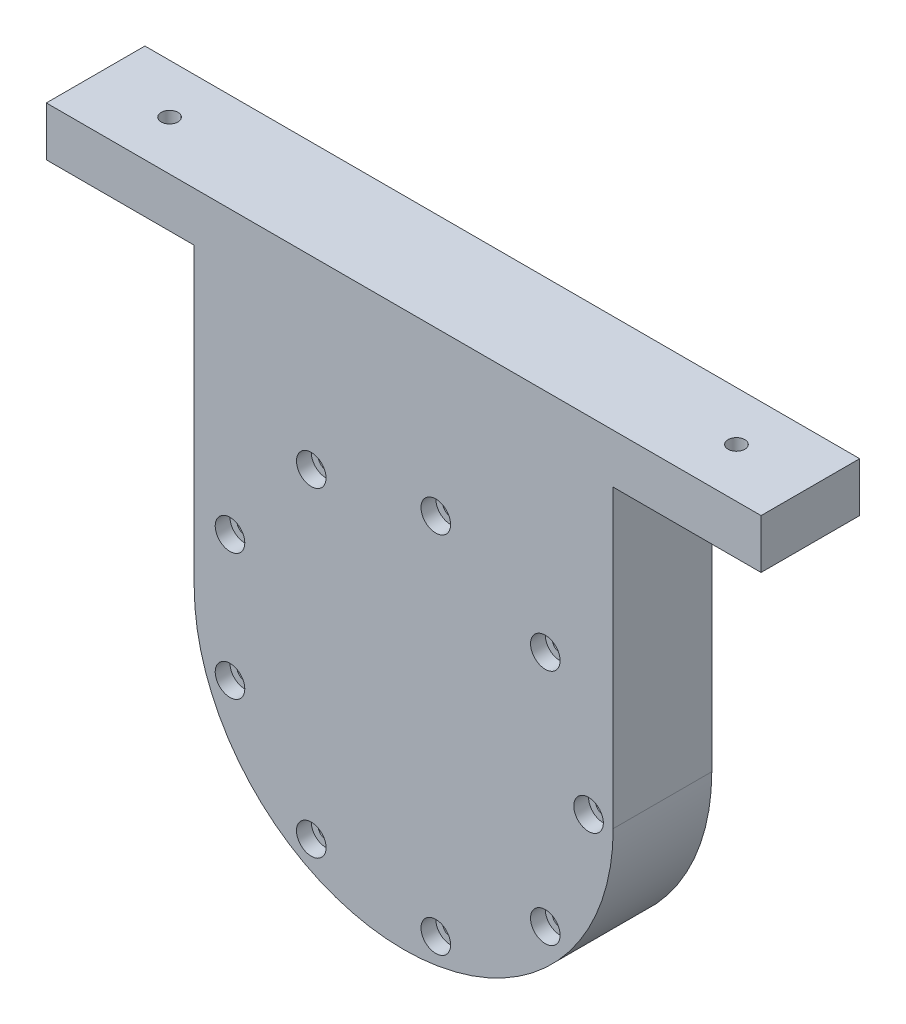
ISO-10303-21;
HEADER;
FILE_DESCRIPTION(('STEP AP214'),'2;1');
FILE_NAME('part.step','',(''),(''),'','','');
FILE_SCHEMA(('AUTOMOTIVE_DESIGN { 1 0 10303 214 1 1 1 1 }'));
ENDSEC;
DATA;
#1=APPLICATION_CONTEXT('core data for automotive mechanical design processes');
#2=APPLICATION_PROTOCOL_DEFINITION('international standard','automotive_design',2000,#1);
#3=PRODUCT_CONTEXT('',#1,'mechanical');
#4=PRODUCT('Part','Part','',(#3));
#5=PRODUCT_RELATED_PRODUCT_CATEGORY('part','',(#4));
#6=PRODUCT_DEFINITION_FORMATION('','',#4);
#7=PRODUCT_DEFINITION_CONTEXT('part definition',#1,'design');
#8=PRODUCT_DEFINITION('design','',#6,#7);
#9=PRODUCT_DEFINITION_SHAPE('','',#8);
#10=(LENGTH_UNIT() NAMED_UNIT(*) SI_UNIT(.MILLI.,.METRE.));
#11=(NAMED_UNIT(*) PLANE_ANGLE_UNIT() SI_UNIT($,.RADIAN.));
#12=(NAMED_UNIT(*) SI_UNIT($,.STERADIAN.) SOLID_ANGLE_UNIT());
#13=UNCERTAINTY_MEASURE_WITH_UNIT(LENGTH_MEASURE(1.E-05),#10,'distance_accuracy_value','');
#14=(GEOMETRIC_REPRESENTATION_CONTEXT(3) GLOBAL_UNCERTAINTY_ASSIGNED_CONTEXT((#13)) GLOBAL_UNIT_ASSIGNED_CONTEXT((#10,
#11,#12)) REPRESENTATION_CONTEXT('',''));
#15=CARTESIAN_POINT('',(0.,0.,0.));
#16=DIRECTION('',(0.,0.,1.));
#17=DIRECTION('',(1.,0.,0.));
#18=AXIS2_PLACEMENT_3D('',#15,#16,#17);
#19=CARTESIAN_POINT('',(37.5,0.,20.));
#20=DIRECTION('',(0.,0.,-1.));
#21=DIRECTION('',(-1.,0.,0.));
#22=AXIS2_PLACEMENT_3D('',#19,#20,#21);
#23=CYLINDRICAL_SURFACE('',#22,1.6);
#24=CARTESIAN_POINT('',(37.5,0.,0.));
#25=DIRECTION('',(0.,0.,1.));
#26=DIRECTION('',(1.,0.,0.));
#27=AXIS2_PLACEMENT_3D('',#24,#25,#26);
#28=CIRCLE('',#27,1.6);
#29=CARTESIAN_POINT('',(39.1,0.,0.));
#30=VERTEX_POINT('',#29);
#31=EDGE_CURVE('E142',#30,#30,#28,.T.);
#32=ORIENTED_EDGE('',*,*,#31,.F.);
#33=EDGE_LOOP('',(#32));
#34=FACE_BOUND('',#33,.T.);
#35=CARTESIAN_POINT('',(37.5,0.,17.));
#36=DIRECTION('',(0.,0.,1.));
#37=DIRECTION('',(1.,0.,0.));
#38=AXIS2_PLACEMENT_3D('',#35,#36,#37);
#39=CIRCLE('',#38,1.6);
#40=CARTESIAN_POINT('',(39.1,0.,17.));
#41=VERTEX_POINT('',#40);
#42=EDGE_CURVE('E43',#41,#41,#39,.T.);
#43=ORIENTED_EDGE('',*,*,#42,.T.);
#44=EDGE_LOOP('',(#43));
#45=FACE_BOUND('',#44,.T.);
#46=ADVANCED_FACE('F39',(#34,#45),#23,.F.);
#47=CARTESIAN_POINT('',(28.7266666169617,-24.1045353632452,20.));
#48=DIRECTION('',(0.,0.,-1.));
#49=DIRECTION('',(-1.,0.,0.));
#50=AXIS2_PLACEMENT_3D('',#47,#48,#49);
#51=CYLINDRICAL_SURFACE('',#50,1.6);
#52=CARTESIAN_POINT('',(28.7266666169617,-24.1045353632452,0.));
#53=DIRECTION('',(0.,0.,1.));
#54=DIRECTION('',(1.,0.,0.));
#55=AXIS2_PLACEMENT_3D('',#52,#53,#54);
#56=CIRCLE('',#55,1.6);
#57=CARTESIAN_POINT('',(30.3266666169617,-24.1045353632452,0.));
#58=VERTEX_POINT('',#57);
#59=EDGE_CURVE('E220',#58,#58,#56,.T.);
#60=ORIENTED_EDGE('',*,*,#59,.F.);
#61=EDGE_LOOP('',(#60));
#62=FACE_BOUND('',#61,.T.);
#63=CARTESIAN_POINT('',(28.7266666169617,-24.1045353632452,17.));
#64=DIRECTION('',(0.,0.,1.));
#65=DIRECTION('',(1.,0.,0.));
#66=AXIS2_PLACEMENT_3D('',#63,#64,#65);
#67=CIRCLE('',#66,1.6);
#68=CARTESIAN_POINT('',(30.3266666169617,-24.1045353632452,17.));
#69=VERTEX_POINT('',#68);
#70=EDGE_CURVE('E186',#69,#69,#67,.T.);
#71=ORIENTED_EDGE('',*,*,#70,.T.);
#72=EDGE_LOOP('',(#71));
#73=FACE_BOUND('',#72,.T.);
#74=ADVANCED_FACE('F264',(#62,#73),#51,.F.);
#75=CARTESIAN_POINT('',(6.51180666250989,-36.9302907379578,20.));
#76=DIRECTION('',(0.,0.,-1.));
#77=DIRECTION('',(-1.,0.,0.));
#78=AXIS2_PLACEMENT_3D('',#75,#76,#77);
#79=CYLINDRICAL_SURFACE('',#78,1.59999999999999);
#80=CARTESIAN_POINT('',(6.51180666250989,-36.9302907379578,0.));
#81=DIRECTION('',(0.,0.,1.));
#82=DIRECTION('',(1.,0.,0.));
#83=AXIS2_PLACEMENT_3D('',#80,#81,#82);
#84=CIRCLE('',#83,1.59999999999999);
#85=CARTESIAN_POINT('',(8.11180666250989,-36.9302907379578,0.));
#86=VERTEX_POINT('',#85);
#87=EDGE_CURVE('E217',#86,#86,#84,.T.);
#88=ORIENTED_EDGE('',*,*,#87,.F.);
#89=EDGE_LOOP('',(#88));
#90=FACE_BOUND('',#89,.T.);
#91=CARTESIAN_POINT('',(6.51180666250989,-36.9302907379578,17.));
#92=DIRECTION('',(0.,0.,1.));
#93=DIRECTION('',(1.,0.,0.));
#94=AXIS2_PLACEMENT_3D('',#91,#92,#93);
#95=CIRCLE('',#94,1.59999999999999);
#96=CARTESIAN_POINT('',(8.11180666250989,-36.9302907379578,17.));
#97=VERTEX_POINT('',#96);
#98=EDGE_CURVE('E184',#97,#97,#95,.T.);
#99=ORIENTED_EDGE('',*,*,#98,.T.);
#100=EDGE_LOOP('',(#99));
#101=FACE_BOUND('',#100,.T.);
#102=ADVANCED_FACE('F270',(#90,#101),#79,.F.);
#103=CARTESIAN_POINT('',(-18.75,-32.4759526419165,20.));
#104=DIRECTION('',(0.,0.,-1.));
#105=DIRECTION('',(-1.,0.,0.));
#106=AXIS2_PLACEMENT_3D('',#103,#104,#105);
#107=CYLINDRICAL_SURFACE('',#106,1.6);
#108=CARTESIAN_POINT('',(-18.75,-32.4759526419165,0.));
#109=DIRECTION('',(0.,0.,1.));
#110=DIRECTION('',(1.,0.,0.));
#111=AXIS2_PLACEMENT_3D('',#108,#109,#110);
#112=CIRCLE('',#111,1.6);
#113=CARTESIAN_POINT('',(-17.15,-32.4759526419165,0.));
#114=VERTEX_POINT('',#113);
#115=EDGE_CURVE('E214',#114,#114,#112,.T.);
#116=ORIENTED_EDGE('',*,*,#115,.F.);
#117=EDGE_LOOP('',(#116));
#118=FACE_BOUND('',#117,.T.);
#119=CARTESIAN_POINT('',(-18.75,-32.4759526419165,17.));
#120=DIRECTION('',(0.,0.,1.));
#121=DIRECTION('',(1.,0.,0.));
#122=AXIS2_PLACEMENT_3D('',#119,#120,#121);
#123=CIRCLE('',#122,1.6);
#124=CARTESIAN_POINT('',(-17.15,-32.4759526419165,17.));
#125=VERTEX_POINT('',#124);
#126=EDGE_CURVE('E181',#125,#125,#123,.T.);
#127=ORIENTED_EDGE('',*,*,#126,.T.);
#128=EDGE_LOOP('',(#127));
#129=FACE_BOUND('',#128,.T.);
#130=ADVANCED_FACE('F518',(#118,#129),#107,.F.);
#131=CARTESIAN_POINT('',(-35.2384732794716,-12.8257553747126,20.));
#132=DIRECTION('',(0.,0.,-1.));
#133=DIRECTION('',(-1.,0.,0.));
#134=AXIS2_PLACEMENT_3D('',#131,#132,#133);
#135=CYLINDRICAL_SURFACE('',#134,1.6);
#136=CARTESIAN_POINT('',(-35.2384732794716,-12.8257553747126,0.));
#137=DIRECTION('',(0.,0.,1.));
#138=DIRECTION('',(1.,0.,0.));
#139=AXIS2_PLACEMENT_3D('',#136,#137,#138);
#140=CIRCLE('',#139,1.6);
#141=CARTESIAN_POINT('',(-33.6384732794716,-12.8257553747126,0.));
#142=VERTEX_POINT('',#141);
#143=EDGE_CURVE('E211',#142,#142,#140,.T.);
#144=ORIENTED_EDGE('',*,*,#143,.F.);
#145=EDGE_LOOP('',(#144));
#146=FACE_BOUND('',#145,.T.);
#147=CARTESIAN_POINT('',(-35.2384732794716,-12.8257553747126,17.));
#148=DIRECTION('',(0.,0.,1.));
#149=DIRECTION('',(1.,0.,0.));
#150=AXIS2_PLACEMENT_3D('',#147,#148,#149);
#151=CIRCLE('',#150,1.6);
#152=CARTESIAN_POINT('',(-33.6384732794716,-12.8257553747126,17.));
#153=VERTEX_POINT('',#152);
#154=EDGE_CURVE('E178',#153,#153,#151,.T.);
#155=ORIENTED_EDGE('',*,*,#154,.T.);
#156=EDGE_LOOP('',(#155));
#157=FACE_BOUND('',#156,.T.);
#158=ADVANCED_FACE('F527',(#146,#157),#135,.F.);
#159=CARTESIAN_POINT('',(-35.2384732794716,12.8257553747126,20.));
#160=DIRECTION('',(0.,0.,-1.));
#161=DIRECTION('',(-1.,0.,0.));
#162=AXIS2_PLACEMENT_3D('',#159,#160,#161);
#163=CYLINDRICAL_SURFACE('',#162,1.6);
#164=CARTESIAN_POINT('',(-35.2384732794716,12.8257553747126,0.));
#165=DIRECTION('',(0.,0.,1.));
#166=DIRECTION('',(1.,0.,0.));
#167=AXIS2_PLACEMENT_3D('',#164,#165,#166);
#168=CIRCLE('',#167,1.6);
#169=CARTESIAN_POINT('',(-33.6384732794716,12.8257553747126,0.));
#170=VERTEX_POINT('',#169);
#171=EDGE_CURVE('E208',#170,#170,#168,.T.);
#172=ORIENTED_EDGE('',*,*,#171,.F.);
#173=EDGE_LOOP('',(#172));
#174=FACE_BOUND('',#173,.T.);
#175=CARTESIAN_POINT('',(-35.2384732794716,12.8257553747126,17.));
#176=DIRECTION('',(0.,0.,1.));
#177=DIRECTION('',(1.,0.,0.));
#178=AXIS2_PLACEMENT_3D('',#175,#176,#177);
#179=CIRCLE('',#178,1.6);
#180=CARTESIAN_POINT('',(-33.6384732794716,12.8257553747126,17.));
#181=VERTEX_POINT('',#180);
#182=EDGE_CURVE('E175',#181,#181,#179,.T.);
#183=ORIENTED_EDGE('',*,*,#182,.T.);
#184=EDGE_LOOP('',(#183));
#185=FACE_BOUND('',#184,.T.);
#186=ADVANCED_FACE('F537',(#174,#185),#163,.F.);
#187=CARTESIAN_POINT('',(-18.75,32.4759526419164,20.));
#188=DIRECTION('',(0.,0.,-1.));
#189=DIRECTION('',(-1.,0.,0.));
#190=AXIS2_PLACEMENT_3D('',#187,#188,#189);
#191=CYLINDRICAL_SURFACE('',#190,1.6);
#192=CARTESIAN_POINT('',(-18.75,32.4759526419164,0.));
#193=DIRECTION('',(0.,0.,1.));
#194=DIRECTION('',(1.,0.,0.));
#195=AXIS2_PLACEMENT_3D('',#192,#193,#194);
#196=CIRCLE('',#195,1.6);
#197=CARTESIAN_POINT('',(-17.15,32.4759526419164,0.));
#198=VERTEX_POINT('',#197);
#199=EDGE_CURVE('E200',#198,#198,#196,.T.);
#200=ORIENTED_EDGE('',*,*,#199,.F.);
#201=EDGE_LOOP('',(#200));
#202=FACE_BOUND('',#201,.T.);
#203=CARTESIAN_POINT('',(-18.75,32.4759526419164,17.));
#204=DIRECTION('',(0.,0.,1.));
#205=DIRECTION('',(1.,0.,0.));
#206=AXIS2_PLACEMENT_3D('',#203,#204,#205);
#207=CIRCLE('',#206,1.6);
#208=CARTESIAN_POINT('',(-17.15,32.4759526419164,17.));
#209=VERTEX_POINT('',#208);
#210=EDGE_CURVE('E172',#209,#209,#207,.T.);
#211=ORIENTED_EDGE('',*,*,#210,.T.);
#212=EDGE_LOOP('',(#211));
#213=FACE_BOUND('',#212,.T.);
#214=ADVANCED_FACE('F547',(#202,#213),#191,.F.);
#215=CARTESIAN_POINT('',(6.51180666250987,36.9302907379578,20.));
#216=DIRECTION('',(0.,0.,-1.));
#217=DIRECTION('',(-1.,0.,0.));
#218=AXIS2_PLACEMENT_3D('',#215,#216,#217);
#219=CYLINDRICAL_SURFACE('',#218,1.6);
#220=CARTESIAN_POINT('',(6.51180666250987,36.9302907379578,0.));
#221=DIRECTION('',(0.,0.,1.));
#222=DIRECTION('',(1.,0.,0.));
#223=AXIS2_PLACEMENT_3D('',#220,#221,#222);
#224=CIRCLE('',#223,1.6);
#225=CARTESIAN_POINT('',(8.11180666250987,36.9302907379578,0.));
#226=VERTEX_POINT('',#225);
#227=EDGE_CURVE('E195',#226,#226,#224,.T.);
#228=ORIENTED_EDGE('',*,*,#227,.F.);
#229=EDGE_LOOP('',(#228));
#230=FACE_BOUND('',#229,.T.);
#231=CARTESIAN_POINT('',(6.51180666250987,36.9302907379578,17.));
#232=DIRECTION('',(0.,0.,1.));
#233=DIRECTION('',(1.,0.,0.));
#234=AXIS2_PLACEMENT_3D('',#231,#232,#233);
#235=CIRCLE('',#234,1.6);
#236=CARTESIAN_POINT('',(8.11180666250987,36.9302907379578,17.));
#237=VERTEX_POINT('',#236);
#238=EDGE_CURVE('E168',#237,#237,#235,.T.);
#239=ORIENTED_EDGE('',*,*,#238,.T.);
#240=EDGE_LOOP('',(#239));
#241=FACE_BOUND('',#240,.T.);
#242=ADVANCED_FACE('F557',(#230,#241),#219,.F.);
#243=CARTESIAN_POINT('',(28.7266666169617,24.1045353632452,20.));
#244=DIRECTION('',(0.,0.,-1.));
#245=DIRECTION('',(-1.,0.,0.));
#246=AXIS2_PLACEMENT_3D('',#243,#244,#245);
#247=CYLINDRICAL_SURFACE('',#246,1.6);
#248=CARTESIAN_POINT('',(28.7266666169617,24.1045353632452,0.));
#249=DIRECTION('',(0.,0.,1.));
#250=DIRECTION('',(1.,0.,0.));
#251=AXIS2_PLACEMENT_3D('',#248,#249,#250);
#252=CIRCLE('',#251,1.6);
#253=CARTESIAN_POINT('',(30.3266666169617,24.1045353632452,0.));
#254=VERTEX_POINT('',#253);
#255=EDGE_CURVE('E191',#254,#254,#252,.T.);
#256=ORIENTED_EDGE('',*,*,#255,.F.);
#257=EDGE_LOOP('',(#256));
#258=FACE_BOUND('',#257,.T.);
#259=CARTESIAN_POINT('',(28.7266666169617,24.1045353632452,17.));
#260=DIRECTION('',(0.,0.,1.));
#261=DIRECTION('',(1.,0.,0.));
#262=AXIS2_PLACEMENT_3D('',#259,#260,#261);
#263=CIRCLE('',#262,1.6);
#264=CARTESIAN_POINT('',(30.3266666169617,24.1045353632452,17.));
#265=VERTEX_POINT('',#264);
#266=EDGE_CURVE('E165',#265,#265,#263,.T.);
#267=ORIENTED_EDGE('',*,*,#266,.T.);
#268=EDGE_LOOP('',(#267));
#269=FACE_BOUND('',#268,.T.);
#270=ADVANCED_FACE('F277',(#258,#269),#247,.F.);
#271=CARTESIAN_POINT('',(0.,0.,20.));
#272=DIRECTION('',(0.,0.,1.));
#273=DIRECTION('',(1.,0.,0.));
#274=AXIS2_PLACEMENT_3D('',#271,#272,#273);
#275=PLANE('',#274);
#276=CARTESIAN_POINT('',(-18.75,32.4759526419165,20.));
#277=DIRECTION('',(0.,0.,1.));
#278=DIRECTION('',(1.,0.,0.));
#279=AXIS2_PLACEMENT_3D('',#276,#277,#278);
#280=CIRCLE('',#279,3.);
#281=CARTESIAN_POINT('',(-15.75,32.4759526419165,20.));
#282=VERTEX_POINT('',#281);
#283=EDGE_CURVE('E683',#282,#282,#280,.T.);
#284=ORIENTED_EDGE('',*,*,#283,.F.);
#285=EDGE_LOOP('',(#284));
#286=FACE_BOUND('',#285,.T.);
#287=CARTESIAN_POINT('',(-35.2384732794716,12.8257553747125,20.));
#288=DIRECTION('',(0.,0.,1.));
#289=DIRECTION('',(1.,0.,0.));
#290=AXIS2_PLACEMENT_3D('',#287,#288,#289);
#291=CIRCLE('',#290,3.);
#292=CARTESIAN_POINT('',(-32.2384732794716,12.8257553747125,20.));
#293=VERTEX_POINT('',#292);
#294=EDGE_CURVE('E677',#293,#293,#291,.T.);
#295=ORIENTED_EDGE('',*,*,#294,.F.);
#296=EDGE_LOOP('',(#295));
#297=FACE_BOUND('',#296,.T.);
#298=CARTESIAN_POINT('',(-35.2384732794716,-12.8257553747126,20.));
#299=DIRECTION('',(0.,0.,1.));
#300=DIRECTION('',(1.,0.,0.));
#301=AXIS2_PLACEMENT_3D('',#298,#299,#300);
#302=CIRCLE('',#301,2.99999999999999);
#303=CARTESIAN_POINT('',(-32.2384732794716,-12.8257553747126,20.));
#304=VERTEX_POINT('',#303);
#305=EDGE_CURVE('E671',#304,#304,#302,.T.);
#306=ORIENTED_EDGE('',*,*,#305,.F.);
#307=EDGE_LOOP('',(#306));
#308=FACE_BOUND('',#307,.T.);
#309=CARTESIAN_POINT('',(-18.75,-32.4759526419165,20.));
#310=DIRECTION('',(0.,0.,1.));
#311=DIRECTION('',(1.,0.,0.));
#312=AXIS2_PLACEMENT_3D('',#309,#310,#311);
#313=CIRCLE('',#312,3.);
#314=CARTESIAN_POINT('',(-15.75,-32.4759526419165,20.));
#315=VERTEX_POINT('',#314);
#316=EDGE_CURVE('E665',#315,#315,#313,.T.);
#317=ORIENTED_EDGE('',*,*,#316,.F.);
#318=EDGE_LOOP('',(#317));
#319=FACE_BOUND('',#318,.T.);
#320=CARTESIAN_POINT('',(6.51180666250991,-36.9302907379578,20.));
#321=DIRECTION('',(0.,0.,1.));
#322=DIRECTION('',(1.,0.,0.));
#323=AXIS2_PLACEMENT_3D('',#320,#321,#322);
#324=CIRCLE('',#323,3.);
#325=CARTESIAN_POINT('',(9.51180666250991,-36.9302907379578,20.));
#326=VERTEX_POINT('',#325);
#327=EDGE_CURVE('E659',#326,#326,#324,.T.);
#328=ORIENTED_EDGE('',*,*,#327,.F.);
#329=EDGE_LOOP('',(#328));
#330=FACE_BOUND('',#329,.T.);
#331=CARTESIAN_POINT('',(28.7266666169617,-24.1045353632452,20.));
#332=DIRECTION('',(0.,0.,1.));
#333=DIRECTION('',(1.,0.,0.));
#334=AXIS2_PLACEMENT_3D('',#331,#332,#333);
#335=CIRCLE('',#334,3.);
#336=CARTESIAN_POINT('',(31.7266666169617,-24.1045353632452,20.));
#337=VERTEX_POINT('',#336);
#338=EDGE_CURVE('E653',#337,#337,#335,.T.);
#339=ORIENTED_EDGE('',*,*,#338,.F.);
#340=EDGE_LOOP('',(#339));
#341=FACE_BOUND('',#340,.T.);
#342=CARTESIAN_POINT('',(37.5,0.,20.));
#343=DIRECTION('',(0.,0.,1.));
#344=DIRECTION('',(1.,0.,0.));
#345=AXIS2_PLACEMENT_3D('',#342,#343,#344);
#346=CIRCLE('',#345,2.99999999999999);
#347=CARTESIAN_POINT('',(40.5,0.,20.));
#348=VERTEX_POINT('',#347);
#349=EDGE_CURVE('E642',#348,#348,#346,.T.);
#350=ORIENTED_EDGE('',*,*,#349,.F.);
#351=EDGE_LOOP('',(#350));
#352=FACE_BOUND('',#351,.T.);
#353=CARTESIAN_POINT('',(28.7266666169617,24.1045353632452,20.));
#354=DIRECTION('',(0.,0.,1.));
#355=DIRECTION('',(1.,0.,0.));
#356=AXIS2_PLACEMENT_3D('',#353,#354,#355);
#357=CIRCLE('',#356,3.);
#358=CARTESIAN_POINT('',(31.7266666169617,24.1045353632452,20.));
#359=VERTEX_POINT('',#358);
#360=EDGE_CURVE('E641',#359,#359,#357,.T.);
#361=ORIENTED_EDGE('',*,*,#360,.F.);
#362=EDGE_LOOP('',(#361));
#363=FACE_BOUND('',#362,.T.);
#364=CARTESIAN_POINT('',(6.51180666250987,36.9302907379578,20.));
#365=DIRECTION('',(0.,0.,1.));
#366=DIRECTION('',(1.,0.,0.));
#367=AXIS2_PLACEMENT_3D('',#364,#365,#366);
#368=CIRCLE('',#367,3.);
#369=CARTESIAN_POINT('',(9.51180666250987,36.9302907379578,20.));
#370=VERTEX_POINT('',#369);
#371=EDGE_CURVE('E203',#370,#370,#368,.T.);
#372=ORIENTED_EDGE('',*,*,#371,.F.);
#373=EDGE_LOOP('',(#372));
#374=FACE_BOUND('',#373,.T.);
#375=CARTESIAN_POINT('',(0.,0.,20.));
#376=DIRECTION('',(0.,0.,1.));
#377=DIRECTION('',(1.,0.,0.));
#378=AXIS2_PLACEMENT_3D('',#375,#376,#377);
#379=CIRCLE('',#378,42.5);
#380=CARTESIAN_POINT('',(-42.5,0.,20.));
#381=VERTEX_POINT('',#380);
#382=CARTESIAN_POINT('',(42.5,0.,20.));
#383=VERTEX_POINT('',#382);
#384=EDGE_CURVE('E153',#381,#383,#379,.T.);
#385=ORIENTED_EDGE('',*,*,#384,.T.);
#386=DIRECTION('',(0.,1.,0.));
#387=VECTOR('',#386,1.);
#388=CARTESIAN_POINT('',(42.5,0.,20.));
#389=LINE('',#388,#387);
#390=CARTESIAN_POINT('',(42.5,60.,20.));
#391=VERTEX_POINT('',#390);
#392=EDGE_CURVE('E101',#383,#391,#389,.T.);
#393=ORIENTED_EDGE('',*,*,#392,.T.);
#394=DIRECTION('',(1.,0.,0.));
#395=VECTOR('',#394,1.);
#396=CARTESIAN_POINT('',(42.5,60.,20.));
#397=LINE('',#396,#395);
#398=CARTESIAN_POINT('',(72.5,60.,20.));
#399=VERTEX_POINT('',#398);
#400=EDGE_CURVE('E227',#391,#399,#397,.T.);
#401=ORIENTED_EDGE('',*,*,#400,.T.);
#402=DIRECTION('',(0.,1.,0.));
#403=VECTOR('',#402,1.);
#404=CARTESIAN_POINT('',(72.5,70.,20.));
#405=LINE('',#404,#403);
#406=CARTESIAN_POINT('',(72.5,70.,20.));
#407=VERTEX_POINT('',#406);
#408=EDGE_CURVE('E229',#399,#407,#405,.T.);
#409=ORIENTED_EDGE('',*,*,#408,.T.);
#410=DIRECTION('',(-1.,0.,0.));
#411=VECTOR('',#410,1.);
#412=CARTESIAN_POINT('',(-72.5,70.,20.));
#413=LINE('',#412,#411);
#414=CARTESIAN_POINT('',(-72.5,70.,20.));
#415=VERTEX_POINT('',#414);
#416=EDGE_CURVE('E120',#407,#415,#413,.T.);
#417=ORIENTED_EDGE('',*,*,#416,.T.);
#418=DIRECTION('',(0.,-1.,0.));
#419=VECTOR('',#418,1.);
#420=CARTESIAN_POINT('',(-72.5,60.,20.));
#421=LINE('',#420,#419);
#422=CARTESIAN_POINT('',(-72.5,60.,20.));
#423=VERTEX_POINT('',#422);
#424=EDGE_CURVE('E114',#415,#423,#421,.T.);
#425=ORIENTED_EDGE('',*,*,#424,.T.);
#426=DIRECTION('',(1.,0.,0.));
#427=VECTOR('',#426,1.);
#428=CARTESIAN_POINT('',(-42.5,60.,20.));
#429=LINE('',#428,#427);
#430=CARTESIAN_POINT('',(-42.5,60.,20.));
#431=VERTEX_POINT('',#430);
#432=EDGE_CURVE('E118',#423,#431,#429,.T.);
#433=ORIENTED_EDGE('',*,*,#432,.T.);
#434=DIRECTION('',(0.,-1.,0.));
#435=VECTOR('',#434,1.);
#436=CARTESIAN_POINT('',(-42.5,0.,20.));
#437=LINE('',#436,#435);
#438=EDGE_CURVE('E58',#431,#381,#437,.T.);
#439=ORIENTED_EDGE('',*,*,#438,.T.);
#440=EDGE_LOOP('',(#385,#393,#401,#409,#417,#425,#433,#439));
#441=FACE_BOUND('',#440,.T.);
#442=ADVANCED_FACE('F116',(#286,#297,#308,#319,#330,#341,#352,#363,#374,#441),#275,.T.);
#443=CARTESIAN_POINT('',(0.,0.,0.));
#444=DIRECTION('',(0.,0.,1.));
#445=DIRECTION('',(1.,0.,0.));
#446=AXIS2_PLACEMENT_3D('',#443,#444,#445);
#447=PLANE('',#446);
#448=CARTESIAN_POINT('',(0.,0.,0.));
#449=DIRECTION('',(0.,0.,1.));
#450=DIRECTION('',(1.,0.,0.));
#451=AXIS2_PLACEMENT_3D('',#448,#449,#450);
#452=CIRCLE('',#451,42.5);
#453=CARTESIAN_POINT('',(-42.5,0.,0.));
#454=VERTEX_POINT('',#453);
#455=CARTESIAN_POINT('',(42.5,0.,0.));
#456=VERTEX_POINT('',#455);
#457=EDGE_CURVE('E138',#454,#456,#452,.T.);
#458=ORIENTED_EDGE('',*,*,#457,.F.);
#459=DIRECTION('',(0.,-1.,0.));
#460=VECTOR('',#459,1.);
#461=CARTESIAN_POINT('',(-42.5,0.,0.));
#462=LINE('',#461,#460);
#463=CARTESIAN_POINT('',(-42.5,60.,0.));
#464=VERTEX_POINT('',#463);
#465=EDGE_CURVE('E93',#464,#454,#462,.T.);
#466=ORIENTED_EDGE('',*,*,#465,.F.);
#467=DIRECTION('',(1.,0.,0.));
#468=VECTOR('',#467,1.);
#469=CARTESIAN_POINT('',(-42.5,60.,0.));
#470=LINE('',#469,#468);
#471=CARTESIAN_POINT('',(-72.5,60.,0.));
#472=VERTEX_POINT('',#471);
#473=EDGE_CURVE('E87',#472,#464,#470,.T.);
#474=ORIENTED_EDGE('',*,*,#473,.F.);
#475=DIRECTION('',(0.,-1.,0.));
#476=VECTOR('',#475,1.);
#477=CARTESIAN_POINT('',(-72.5,60.,0.));
#478=LINE('',#477,#476);
#479=CARTESIAN_POINT('',(-72.5,70.,0.));
#480=VERTEX_POINT('',#479);
#481=EDGE_CURVE('E128',#480,#472,#478,.T.);
#482=ORIENTED_EDGE('',*,*,#481,.F.);
#483=DIRECTION('',(-1.,0.,0.));
#484=VECTOR('',#483,1.);
#485=CARTESIAN_POINT('',(-72.5,70.,0.));
#486=LINE('',#485,#484);
#487=CARTESIAN_POINT('',(72.5,70.,0.));
#488=VERTEX_POINT('',#487);
#489=EDGE_CURVE('E148',#488,#480,#486,.T.);
#490=ORIENTED_EDGE('',*,*,#489,.F.);
#491=DIRECTION('',(0.,1.,0.));
#492=VECTOR('',#491,1.);
#493=CARTESIAN_POINT('',(72.5,70.,0.));
#494=LINE('',#493,#492);
#495=CARTESIAN_POINT('',(72.5,60.,0.));
#496=VERTEX_POINT('',#495);
#497=EDGE_CURVE('E146',#496,#488,#494,.T.);
#498=ORIENTED_EDGE('',*,*,#497,.F.);
#499=DIRECTION('',(1.,0.,0.));
#500=VECTOR('',#499,1.);
#501=CARTESIAN_POINT('',(42.5,60.,0.));
#502=LINE('',#501,#500);
#503=CARTESIAN_POINT('',(42.5,60.,0.));
#504=VERTEX_POINT('',#503);
#505=EDGE_CURVE('E144',#504,#496,#502,.T.);
#506=ORIENTED_EDGE('',*,*,#505,.F.);
#507=DIRECTION('',(0.,1.,0.));
#508=VECTOR('',#507,1.);
#509=CARTESIAN_POINT('',(42.5,0.,0.));
#510=LINE('',#509,#508);
#511=EDGE_CURVE('E141',#456,#504,#510,.T.);
#512=ORIENTED_EDGE('',*,*,#511,.F.);
#513=EDGE_LOOP('',(#458,#466,#474,#482,#490,#498,#506,#512));
#514=FACE_BOUND('',#513,.T.);
#515=ORIENTED_EDGE('',*,*,#31,.T.);
#516=EDGE_LOOP('',(#515));
#517=FACE_BOUND('',#516,.T.);
#518=ORIENTED_EDGE('',*,*,#59,.T.);
#519=EDGE_LOOP('',(#518));
#520=FACE_BOUND('',#519,.T.);
#521=ORIENTED_EDGE('',*,*,#87,.T.);
#522=EDGE_LOOP('',(#521));
#523=FACE_BOUND('',#522,.T.);
#524=ORIENTED_EDGE('',*,*,#115,.T.);
#525=EDGE_LOOP('',(#524));
#526=FACE_BOUND('',#525,.T.);
#527=ORIENTED_EDGE('',*,*,#143,.T.);
#528=EDGE_LOOP('',(#527));
#529=FACE_BOUND('',#528,.T.);
#530=ORIENTED_EDGE('',*,*,#171,.T.);
#531=EDGE_LOOP('',(#530));
#532=FACE_BOUND('',#531,.T.);
#533=ORIENTED_EDGE('',*,*,#199,.T.);
#534=EDGE_LOOP('',(#533));
#535=FACE_BOUND('',#534,.T.);
#536=ORIENTED_EDGE('',*,*,#227,.T.);
#537=EDGE_LOOP('',(#536));
#538=FACE_BOUND('',#537,.T.);
#539=ORIENTED_EDGE('',*,*,#255,.T.);
#540=EDGE_LOOP('',(#539));
#541=FACE_BOUND('',#540,.T.);
#542=ADVANCED_FACE('F242',(#514,#517,#520,#523,#526,#529,#532,#535,#538,#541),#447,.F.);
#543=CARTESIAN_POINT('',(0.,0.,20.));
#544=DIRECTION('',(0.,0.,-1.));
#545=DIRECTION('',(-1.,0.,0.));
#546=AXIS2_PLACEMENT_3D('',#543,#544,#545);
#547=CYLINDRICAL_SURFACE('',#546,42.5);
#548=ORIENTED_EDGE('',*,*,#457,.T.);
#549=DIRECTION('',(0.,0.,-1.));
#550=VECTOR('',#549,1.);
#551=CARTESIAN_POINT('',(42.5,0.,20.));
#552=LINE('',#551,#550);
#553=EDGE_CURVE('E11',#383,#456,#552,.T.);
#554=ORIENTED_EDGE('',*,*,#553,.F.);
#555=ORIENTED_EDGE('',*,*,#384,.F.);
#556=DIRECTION('',(0.,0.,-1.));
#557=VECTOR('',#556,1.);
#558=CARTESIAN_POINT('',(-42.5,0.,20.));
#559=LINE('',#558,#557);
#560=EDGE_CURVE('E134',#381,#454,#559,.T.);
#561=ORIENTED_EDGE('',*,*,#560,.T.);
#562=EDGE_LOOP('',(#548,#554,#555,#561));
#563=FACE_BOUND('',#562,.T.);
#564=ADVANCED_FACE('F41',(#563),#547,.T.);
#565=CARTESIAN_POINT('',(42.5,0.,20.));
#566=DIRECTION('',(-1.,0.,0.));
#567=DIRECTION('',(0.,0.,1.));
#568=AXIS2_PLACEMENT_3D('',#565,#566,#567);
#569=PLANE('',#568);
#570=ORIENTED_EDGE('',*,*,#511,.T.);
#571=DIRECTION('',(0.,0.,-1.));
#572=VECTOR('',#571,1.);
#573=CARTESIAN_POINT('',(42.5,60.,20.));
#574=LINE('',#573,#572);
#575=EDGE_CURVE('E49',#391,#504,#574,.T.);
#576=ORIENTED_EDGE('',*,*,#575,.F.);
#577=ORIENTED_EDGE('',*,*,#392,.F.);
#578=ORIENTED_EDGE('',*,*,#553,.T.);
#579=EDGE_LOOP('',(#570,#576,#577,#578));
#580=FACE_BOUND('',#579,.T.);
#581=ADVANCED_FACE('F283',(#580),#569,.F.);
#582=CARTESIAN_POINT('',(42.5,60.,20.));
#583=DIRECTION('',(0.,1.,0.));
#584=DIRECTION('',(0.,0.,1.));
#585=AXIS2_PLACEMENT_3D('',#582,#583,#584);
#586=PLANE('',#585);
#587=CARTESIAN_POINT('',(57.5,60.,10.));
#588=DIRECTION('',(0.,-1.,0.));
#589=DIRECTION('',(0.,0.,-1.));
#590=AXIS2_PLACEMENT_3D('',#587,#588,#589);
#591=CIRCLE('',#590,1.7);
#592=CARTESIAN_POINT('',(57.5,60.,8.3));
#593=VERTEX_POINT('',#592);
#594=EDGE_CURVE('E699',#593,#593,#591,.T.);
#595=ORIENTED_EDGE('',*,*,#594,.F.);
#596=EDGE_LOOP('',(#595));
#597=FACE_BOUND('',#596,.T.);
#598=ORIENTED_EDGE('',*,*,#505,.T.);
#599=DIRECTION('',(0.,0.,-1.));
#600=VECTOR('',#599,1.);
#601=CARTESIAN_POINT('',(72.5,60.,20.));
#602=LINE('',#601,#600);
#603=EDGE_CURVE('E160',#399,#496,#602,.T.);
#604=ORIENTED_EDGE('',*,*,#603,.F.);
#605=ORIENTED_EDGE('',*,*,#400,.F.);
#606=ORIENTED_EDGE('',*,*,#575,.T.);
#607=EDGE_LOOP('',(#598,#604,#605,#606));
#608=FACE_BOUND('',#607,.T.);
#609=ADVANCED_FACE('F287',(#597,#608),#586,.F.);
#610=CARTESIAN_POINT('',(72.5,70.,20.));
#611=DIRECTION('',(-1.,0.,0.));
#612=DIRECTION('',(0.,-1.,0.));
#613=AXIS2_PLACEMENT_3D('',#610,#611,#612);
#614=PLANE('',#613);
#615=ORIENTED_EDGE('',*,*,#497,.T.);
#616=DIRECTION('',(0.,0.,-1.));
#617=VECTOR('',#616,1.);
#618=CARTESIAN_POINT('',(72.5,70.,20.));
#619=LINE('',#618,#617);
#620=EDGE_CURVE('E157',#407,#488,#619,.T.);
#621=ORIENTED_EDGE('',*,*,#620,.F.);
#622=ORIENTED_EDGE('',*,*,#408,.F.);
#623=ORIENTED_EDGE('',*,*,#603,.T.);
#624=EDGE_LOOP('',(#615,#621,#622,#623));
#625=FACE_BOUND('',#624,.T.);
#626=ADVANCED_FACE('F235',(#625),#614,.F.);
#627=CARTESIAN_POINT('',(-72.5,70.,20.));
#628=DIRECTION('',(0.,-1.,0.));
#629=DIRECTION('',(1.,0.,0.));
#630=AXIS2_PLACEMENT_3D('',#627,#628,#629);
#631=PLANE('',#630);
#632=CARTESIAN_POINT('',(57.5,70.,10.));
#633=DIRECTION('',(0.,-1.,0.));
#634=DIRECTION('',(0.,0.,-1.));
#635=AXIS2_PLACEMENT_3D('',#632,#633,#634);
#636=CIRCLE('',#635,1.7);
#637=CARTESIAN_POINT('',(57.5,70.,8.3));
#638=VERTEX_POINT('',#637);
#639=EDGE_CURVE('E688',#638,#638,#636,.T.);
#640=ORIENTED_EDGE('',*,*,#639,.T.);
#641=EDGE_LOOP('',(#640));
#642=FACE_BOUND('',#641,.T.);
#643=CARTESIAN_POINT('',(-57.5,70.,10.));
#644=DIRECTION('',(0.,-1.,0.));
#645=DIRECTION('',(0.,0.,-1.));
#646=AXIS2_PLACEMENT_3D('',#643,#644,#645);
#647=CIRCLE('',#646,1.7);
#648=CARTESIAN_POINT('',(-57.5,70.,8.3));
#649=VERTEX_POINT('',#648);
#650=EDGE_CURVE('E707',#649,#649,#647,.T.);
#651=ORIENTED_EDGE('',*,*,#650,.T.);
#652=EDGE_LOOP('',(#651));
#653=FACE_BOUND('',#652,.T.);
#654=ORIENTED_EDGE('',*,*,#489,.T.);
#655=DIRECTION('',(0.,0.,-1.));
#656=VECTOR('',#655,1.);
#657=CARTESIAN_POINT('',(-72.5,70.,20.));
#658=LINE('',#657,#656);
#659=EDGE_CURVE('E129',#415,#480,#658,.T.);
#660=ORIENTED_EDGE('',*,*,#659,.F.);
#661=ORIENTED_EDGE('',*,*,#416,.F.);
#662=ORIENTED_EDGE('',*,*,#620,.T.);
#663=EDGE_LOOP('',(#654,#660,#661,#662));
#664=FACE_BOUND('',#663,.T.);
#665=ADVANCED_FACE('F239',(#642,#653,#664),#631,.F.);
#666=CARTESIAN_POINT('',(-72.5,60.,20.));
#667=DIRECTION('',(1.,0.,0.));
#668=DIRECTION('',(0.,1.,0.));
#669=AXIS2_PLACEMENT_3D('',#666,#667,#668);
#670=PLANE('',#669);
#671=ORIENTED_EDGE('',*,*,#481,.T.);
#672=DIRECTION('',(0.,0.,-1.));
#673=VECTOR('',#672,1.);
#674=CARTESIAN_POINT('',(-72.5,60.,20.));
#675=LINE('',#674,#673);
#676=EDGE_CURVE('E125',#423,#472,#675,.T.);
#677=ORIENTED_EDGE('',*,*,#676,.F.);
#678=ORIENTED_EDGE('',*,*,#424,.F.);
#679=ORIENTED_EDGE('',*,*,#659,.T.);
#680=EDGE_LOOP('',(#671,#677,#678,#679));
#681=FACE_BOUND('',#680,.T.);
#682=ADVANCED_FACE('F126',(#681),#670,.F.);
#683=CARTESIAN_POINT('',(-42.5,60.,20.));
#684=DIRECTION('',(0.,1.,0.));
#685=DIRECTION('',(-1.,0.,0.));
#686=AXIS2_PLACEMENT_3D('',#683,#684,#685);
#687=PLANE('',#686);
#688=CARTESIAN_POINT('',(-57.5,60.,10.));
#689=DIRECTION('',(0.,-1.,0.));
#690=DIRECTION('',(0.,0.,-1.));
#691=AXIS2_PLACEMENT_3D('',#688,#689,#690);
#692=CIRCLE('',#691,1.7);
#693=CARTESIAN_POINT('',(-57.5,60.,8.3));
#694=VERTEX_POINT('',#693);
#695=EDGE_CURVE('E703',#694,#694,#692,.T.);
#696=ORIENTED_EDGE('',*,*,#695,.F.);
#697=EDGE_LOOP('',(#696));
#698=FACE_BOUND('',#697,.T.);
#699=ORIENTED_EDGE('',*,*,#473,.T.);
#700=DIRECTION('',(0.,0.,-1.));
#701=VECTOR('',#700,1.);
#702=CARTESIAN_POINT('',(-42.5,60.,20.));
#703=LINE('',#702,#701);
#704=EDGE_CURVE('E130',#431,#464,#703,.T.);
#705=ORIENTED_EDGE('',*,*,#704,.F.);
#706=ORIENTED_EDGE('',*,*,#432,.F.);
#707=ORIENTED_EDGE('',*,*,#676,.T.);
#708=EDGE_LOOP('',(#699,#705,#706,#707));
#709=FACE_BOUND('',#708,.T.);
#710=ADVANCED_FACE('F132',(#698,#709),#687,.F.);
#711=CARTESIAN_POINT('',(-42.5,0.,20.));
#712=DIRECTION('',(1.,0.,0.));
#713=DIRECTION('',(0.,0.,-1.));
#714=AXIS2_PLACEMENT_3D('',#711,#712,#713);
#715=PLANE('',#714);
#716=ORIENTED_EDGE('',*,*,#465,.T.);
#717=ORIENTED_EDGE('',*,*,#560,.F.);
#718=ORIENTED_EDGE('',*,*,#438,.F.);
#719=ORIENTED_EDGE('',*,*,#704,.T.);
#720=EDGE_LOOP('',(#716,#717,#718,#719));
#721=FACE_BOUND('',#720,.T.);
#722=ADVANCED_FACE('F248',(#721),#715,.F.);
#723=CARTESIAN_POINT('',(28.7266666169617,24.1045353632452,17.));
#724=DIRECTION('',(0.,0.,1.));
#725=DIRECTION('',(1.,0.,0.));
#726=AXIS2_PLACEMENT_3D('',#723,#724,#725);
#727=CYLINDRICAL_SURFACE('',#726,3.);
#728=CARTESIAN_POINT('',(28.7266666169617,24.1045353632452,17.));
#729=DIRECTION('',(0.,0.,1.));
#730=DIRECTION('',(1.,0.,0.));
#731=AXIS2_PLACEMENT_3D('',#728,#729,#730);
#732=CIRCLE('',#731,3.);
#733=CARTESIAN_POINT('',(31.7266666169617,24.1045353632452,17.));
#734=VERTEX_POINT('',#733);
#735=EDGE_CURVE('E640',#734,#734,#732,.T.);
#736=ORIENTED_EDGE('',*,*,#735,.F.);
#737=EDGE_LOOP('',(#736));
#738=FACE_BOUND('',#737,.T.);
#739=ORIENTED_EDGE('',*,*,#360,.T.);
#740=EDGE_LOOP('',(#739));
#741=FACE_BOUND('',#740,.T.);
#742=ADVANCED_FACE('F250',(#738,#741),#727,.F.);
#743=CARTESIAN_POINT('',(28.7266666169617,24.1045353632452,17.));
#744=DIRECTION('',(0.,0.,1.));
#745=DIRECTION('',(1.,0.,0.));
#746=AXIS2_PLACEMENT_3D('',#743,#744,#745);
#747=PLANE('',#746);
#748=ORIENTED_EDGE('',*,*,#266,.F.);
#749=EDGE_LOOP('',(#748));
#750=FACE_BOUND('',#749,.T.);
#751=ORIENTED_EDGE('',*,*,#735,.T.);
#752=EDGE_LOOP('',(#751));
#753=FACE_BOUND('',#752,.T.);
#754=ADVANCED_FACE('F257',(#750,#753),#747,.T.);
#755=CARTESIAN_POINT('',(6.51180666250987,36.9302907379578,17.));
#756=DIRECTION('',(0.,0.,1.));
#757=DIRECTION('',(1.,0.,0.));
#758=AXIS2_PLACEMENT_3D('',#755,#756,#757);
#759=CYLINDRICAL_SURFACE('',#758,3.);
#760=CARTESIAN_POINT('',(6.51180666250987,36.9302907379578,17.));
#761=DIRECTION('',(0.,0.,1.));
#762=DIRECTION('',(1.,0.,0.));
#763=AXIS2_PLACEMENT_3D('',#760,#761,#762);
#764=CIRCLE('',#763,3.);
#765=CARTESIAN_POINT('',(9.51180666250987,36.9302907379578,17.));
#766=VERTEX_POINT('',#765);
#767=EDGE_CURVE('E169',#766,#766,#764,.T.);
#768=ORIENTED_EDGE('',*,*,#767,.F.);
#769=EDGE_LOOP('',(#768));
#770=FACE_BOUND('',#769,.T.);
#771=ORIENTED_EDGE('',*,*,#371,.T.);
#772=EDGE_LOOP('',(#771));
#773=FACE_BOUND('',#772,.T.);
#774=ADVANCED_FACE('F478',(#770,#773),#759,.F.);
#775=CARTESIAN_POINT('',(6.51180666250987,36.9302907379578,17.));
#776=DIRECTION('',(0.,0.,1.));
#777=DIRECTION('',(1.,0.,0.));
#778=AXIS2_PLACEMENT_3D('',#775,#776,#777);
#779=PLANE('',#778);
#780=ORIENTED_EDGE('',*,*,#238,.F.);
#781=EDGE_LOOP('',(#780));
#782=FACE_BOUND('',#781,.T.);
#783=ORIENTED_EDGE('',*,*,#767,.T.);
#784=EDGE_LOOP('',(#783));
#785=FACE_BOUND('',#784,.T.);
#786=ADVANCED_FACE('F469',(#782,#785),#779,.T.);
#787=CARTESIAN_POINT('',(-18.75,32.4759526419165,17.));
#788=DIRECTION('',(0.,0.,1.));
#789=DIRECTION('',(1.,0.,0.));
#790=AXIS2_PLACEMENT_3D('',#787,#788,#789);
#791=CYLINDRICAL_SURFACE('',#790,3.);
#792=CARTESIAN_POINT('',(-18.75,32.4759526419165,17.));
#793=DIRECTION('',(0.,0.,1.));
#794=DIRECTION('',(1.,0.,0.));
#795=AXIS2_PLACEMENT_3D('',#792,#793,#794);
#796=CIRCLE('',#795,3.);
#797=CARTESIAN_POINT('',(-15.75,32.4759526419165,17.));
#798=VERTEX_POINT('',#797);
#799=EDGE_CURVE('E686',#798,#798,#796,.T.);
#800=ORIENTED_EDGE('',*,*,#799,.F.);
#801=EDGE_LOOP('',(#800));
#802=FACE_BOUND('',#801,.T.);
#803=ORIENTED_EDGE('',*,*,#283,.T.);
#804=EDGE_LOOP('',(#803));
#805=FACE_BOUND('',#804,.T.);
#806=ADVANCED_FACE('F460',(#802,#805),#791,.F.);
#807=CARTESIAN_POINT('',(-18.75,32.4759526419165,17.));
#808=DIRECTION('',(0.,0.,1.));
#809=DIRECTION('',(1.,0.,0.));
#810=AXIS2_PLACEMENT_3D('',#807,#808,#809);
#811=PLANE('',#810);
#812=ORIENTED_EDGE('',*,*,#210,.F.);
#813=EDGE_LOOP('',(#812));
#814=FACE_BOUND('',#813,.T.);
#815=ORIENTED_EDGE('',*,*,#799,.T.);
#816=EDGE_LOOP('',(#815));
#817=FACE_BOUND('',#816,.T.);
#818=ADVANCED_FACE('F451',(#814,#817),#811,.T.);
#819=CARTESIAN_POINT('',(-35.2384732794716,12.8257553747125,17.));
#820=DIRECTION('',(0.,0.,1.));
#821=DIRECTION('',(1.,0.,0.));
#822=AXIS2_PLACEMENT_3D('',#819,#820,#821);
#823=CYLINDRICAL_SURFACE('',#822,3.);
#824=CARTESIAN_POINT('',(-35.2384732794716,12.8257553747125,17.));
#825=DIRECTION('',(0.,0.,1.));
#826=DIRECTION('',(1.,0.,0.));
#827=AXIS2_PLACEMENT_3D('',#824,#825,#826);
#828=CIRCLE('',#827,3.);
#829=CARTESIAN_POINT('',(-32.2384732794716,12.8257553747125,17.));
#830=VERTEX_POINT('',#829);
#831=EDGE_CURVE('E680',#830,#830,#828,.T.);
#832=ORIENTED_EDGE('',*,*,#831,.F.);
#833=EDGE_LOOP('',(#832));
#834=FACE_BOUND('',#833,.T.);
#835=ORIENTED_EDGE('',*,*,#294,.T.);
#836=EDGE_LOOP('',(#835));
#837=FACE_BOUND('',#836,.T.);
#838=ADVANCED_FACE('F442',(#834,#837),#823,.F.);
#839=CARTESIAN_POINT('',(-35.2384732794716,12.8257553747125,17.));
#840=DIRECTION('',(0.,0.,1.));
#841=DIRECTION('',(1.,0.,0.));
#842=AXIS2_PLACEMENT_3D('',#839,#840,#841);
#843=PLANE('',#842);
#844=ORIENTED_EDGE('',*,*,#182,.F.);
#845=EDGE_LOOP('',(#844));
#846=FACE_BOUND('',#845,.T.);
#847=ORIENTED_EDGE('',*,*,#831,.T.);
#848=EDGE_LOOP('',(#847));
#849=FACE_BOUND('',#848,.T.);
#850=ADVANCED_FACE('F433',(#846,#849),#843,.T.);
#851=CARTESIAN_POINT('',(-35.2384732794716,-12.8257553747126,17.));
#852=DIRECTION('',(0.,0.,1.));
#853=DIRECTION('',(1.,0.,0.));
#854=AXIS2_PLACEMENT_3D('',#851,#852,#853);
#855=CYLINDRICAL_SURFACE('',#854,2.99999999999999);
#856=CARTESIAN_POINT('',(-35.2384732794716,-12.8257553747126,17.));
#857=DIRECTION('',(0.,0.,1.));
#858=DIRECTION('',(1.,0.,0.));
#859=AXIS2_PLACEMENT_3D('',#856,#857,#858);
#860=CIRCLE('',#859,2.99999999999999);
#861=CARTESIAN_POINT('',(-32.2384732794716,-12.8257553747126,17.));
#862=VERTEX_POINT('',#861);
#863=EDGE_CURVE('E674',#862,#862,#860,.T.);
#864=ORIENTED_EDGE('',*,*,#863,.F.);
#865=EDGE_LOOP('',(#864));
#866=FACE_BOUND('',#865,.T.);
#867=ORIENTED_EDGE('',*,*,#305,.T.);
#868=EDGE_LOOP('',(#867));
#869=FACE_BOUND('',#868,.T.);
#870=ADVANCED_FACE('F424',(#866,#869),#855,.F.);
#871=CARTESIAN_POINT('',(-35.2384732794716,-12.8257553747126,17.));
#872=DIRECTION('',(0.,0.,1.));
#873=DIRECTION('',(1.,0.,0.));
#874=AXIS2_PLACEMENT_3D('',#871,#872,#873);
#875=PLANE('',#874);
#876=ORIENTED_EDGE('',*,*,#154,.F.);
#877=EDGE_LOOP('',(#876));
#878=FACE_BOUND('',#877,.T.);
#879=ORIENTED_EDGE('',*,*,#863,.T.);
#880=EDGE_LOOP('',(#879));
#881=FACE_BOUND('',#880,.T.);
#882=ADVANCED_FACE('F415',(#878,#881),#875,.T.);
#883=CARTESIAN_POINT('',(-18.75,-32.4759526419165,17.));
#884=DIRECTION('',(0.,0.,1.));
#885=DIRECTION('',(1.,0.,0.));
#886=AXIS2_PLACEMENT_3D('',#883,#884,#885);
#887=CYLINDRICAL_SURFACE('',#886,3.);
#888=CARTESIAN_POINT('',(-18.75,-32.4759526419165,17.));
#889=DIRECTION('',(0.,0.,1.));
#890=DIRECTION('',(1.,0.,0.));
#891=AXIS2_PLACEMENT_3D('',#888,#889,#890);
#892=CIRCLE('',#891,3.);
#893=CARTESIAN_POINT('',(-15.75,-32.4759526419165,17.));
#894=VERTEX_POINT('',#893);
#895=EDGE_CURVE('E668',#894,#894,#892,.T.);
#896=ORIENTED_EDGE('',*,*,#895,.F.);
#897=EDGE_LOOP('',(#896));
#898=FACE_BOUND('',#897,.T.);
#899=ORIENTED_EDGE('',*,*,#316,.T.);
#900=EDGE_LOOP('',(#899));
#901=FACE_BOUND('',#900,.T.);
#902=ADVANCED_FACE('F406',(#898,#901),#887,.F.);
#903=CARTESIAN_POINT('',(-18.75,-32.4759526419165,17.));
#904=DIRECTION('',(0.,0.,1.));
#905=DIRECTION('',(1.,0.,0.));
#906=AXIS2_PLACEMENT_3D('',#903,#904,#905);
#907=PLANE('',#906);
#908=ORIENTED_EDGE('',*,*,#126,.F.);
#909=EDGE_LOOP('',(#908));
#910=FACE_BOUND('',#909,.T.);
#911=ORIENTED_EDGE('',*,*,#895,.T.);
#912=EDGE_LOOP('',(#911));
#913=FACE_BOUND('',#912,.T.);
#914=ADVANCED_FACE('F397',(#910,#913),#907,.T.);
#915=CARTESIAN_POINT('',(6.51180666250991,-36.9302907379578,17.));
#916=DIRECTION('',(0.,0.,1.));
#917=DIRECTION('',(1.,0.,0.));
#918=AXIS2_PLACEMENT_3D('',#915,#916,#917);
#919=CYLINDRICAL_SURFACE('',#918,3.);
#920=CARTESIAN_POINT('',(6.51180666250991,-36.9302907379578,17.));
#921=DIRECTION('',(0.,0.,1.));
#922=DIRECTION('',(1.,0.,0.));
#923=AXIS2_PLACEMENT_3D('',#920,#921,#922);
#924=CIRCLE('',#923,3.);
#925=CARTESIAN_POINT('',(9.51180666250991,-36.9302907379578,17.));
#926=VERTEX_POINT('',#925);
#927=EDGE_CURVE('E662',#926,#926,#924,.T.);
#928=ORIENTED_EDGE('',*,*,#927,.F.);
#929=EDGE_LOOP('',(#928));
#930=FACE_BOUND('',#929,.T.);
#931=ORIENTED_EDGE('',*,*,#327,.T.);
#932=EDGE_LOOP('',(#931));
#933=FACE_BOUND('',#932,.T.);
#934=ADVANCED_FACE('F388',(#930,#933),#919,.F.);
#935=CARTESIAN_POINT('',(6.51180666250991,-36.9302907379578,17.));
#936=DIRECTION('',(0.,0.,1.));
#937=DIRECTION('',(1.,0.,0.));
#938=AXIS2_PLACEMENT_3D('',#935,#936,#937);
#939=PLANE('',#938);
#940=ORIENTED_EDGE('',*,*,#98,.F.);
#941=EDGE_LOOP('',(#940));
#942=FACE_BOUND('',#941,.T.);
#943=ORIENTED_EDGE('',*,*,#927,.T.);
#944=EDGE_LOOP('',(#943));
#945=FACE_BOUND('',#944,.T.);
#946=ADVANCED_FACE('F379',(#942,#945),#939,.T.);
#947=CARTESIAN_POINT('',(28.7266666169617,-24.1045353632452,17.));
#948=DIRECTION('',(0.,0.,1.));
#949=DIRECTION('',(1.,0.,0.));
#950=AXIS2_PLACEMENT_3D('',#947,#948,#949);
#951=CYLINDRICAL_SURFACE('',#950,3.);
#952=CARTESIAN_POINT('',(28.7266666169617,-24.1045353632452,17.));
#953=DIRECTION('',(0.,0.,1.));
#954=DIRECTION('',(1.,0.,0.));
#955=AXIS2_PLACEMENT_3D('',#952,#953,#954);
#956=CIRCLE('',#955,3.);
#957=CARTESIAN_POINT('',(31.7266666169617,-24.1045353632452,17.));
#958=VERTEX_POINT('',#957);
#959=EDGE_CURVE('E656',#958,#958,#956,.T.);
#960=ORIENTED_EDGE('',*,*,#959,.F.);
#961=EDGE_LOOP('',(#960));
#962=FACE_BOUND('',#961,.T.);
#963=ORIENTED_EDGE('',*,*,#338,.T.);
#964=EDGE_LOOP('',(#963));
#965=FACE_BOUND('',#964,.T.);
#966=ADVANCED_FACE('F370',(#962,#965),#951,.F.);
#967=CARTESIAN_POINT('',(28.7266666169617,-24.1045353632452,17.));
#968=DIRECTION('',(0.,0.,1.));
#969=DIRECTION('',(1.,0.,0.));
#970=AXIS2_PLACEMENT_3D('',#967,#968,#969);
#971=PLANE('',#970);
#972=ORIENTED_EDGE('',*,*,#70,.F.);
#973=EDGE_LOOP('',(#972));
#974=FACE_BOUND('',#973,.T.);
#975=ORIENTED_EDGE('',*,*,#959,.T.);
#976=EDGE_LOOP('',(#975));
#977=FACE_BOUND('',#976,.T.);
#978=ADVANCED_FACE('F361',(#974,#977),#971,.T.);
#979=CARTESIAN_POINT('',(37.5,0.,17.));
#980=DIRECTION('',(0.,0.,1.));
#981=DIRECTION('',(1.,0.,0.));
#982=AXIS2_PLACEMENT_3D('',#979,#980,#981);
#983=CYLINDRICAL_SURFACE('',#982,2.99999999999999);
#984=CARTESIAN_POINT('',(37.5,0.,17.));
#985=DIRECTION('',(0.,0.,1.));
#986=DIRECTION('',(1.,0.,0.));
#987=AXIS2_PLACEMENT_3D('',#984,#985,#986);
#988=CIRCLE('',#987,2.99999999999999);
#989=CARTESIAN_POINT('',(40.5,0.,17.));
#990=VERTEX_POINT('',#989);
#991=EDGE_CURVE('E647',#990,#990,#988,.T.);
#992=ORIENTED_EDGE('',*,*,#991,.F.);
#993=EDGE_LOOP('',(#992));
#994=FACE_BOUND('',#993,.T.);
#995=ORIENTED_EDGE('',*,*,#349,.T.);
#996=EDGE_LOOP('',(#995));
#997=FACE_BOUND('',#996,.T.);
#998=ADVANCED_FACE('F352',(#994,#997),#983,.F.);
#999=CARTESIAN_POINT('',(37.5,0.,17.));
#1000=DIRECTION('',(0.,0.,1.));
#1001=DIRECTION('',(1.,0.,0.));
#1002=AXIS2_PLACEMENT_3D('',#999,#1000,#1001);
#1003=PLANE('',#1002);
#1004=ORIENTED_EDGE('',*,*,#42,.F.);
#1005=EDGE_LOOP('',(#1004));
#1006=FACE_BOUND('',#1005,.T.);
#1007=ORIENTED_EDGE('',*,*,#991,.T.);
#1008=EDGE_LOOP('',(#1007));
#1009=FACE_BOUND('',#1008,.T.);
#1010=ADVANCED_FACE('F333',(#1006,#1009),#1003,.T.);
#1011=CARTESIAN_POINT('',(-57.5,70.,10.));
#1012=DIRECTION('',(0.,-1.,0.));
#1013=DIRECTION('',(0.,0.,-1.));
#1014=AXIS2_PLACEMENT_3D('',#1011,#1012,#1013);
#1015=CYLINDRICAL_SURFACE('',#1014,1.7);
#1016=ORIENTED_EDGE('',*,*,#650,.F.);
#1017=EDGE_LOOP('',(#1016));
#1018=FACE_BOUND('',#1017,.T.);
#1019=ORIENTED_EDGE('',*,*,#695,.T.);
#1020=EDGE_LOOP('',(#1019));
#1021=FACE_BOUND('',#1020,.T.);
#1022=ADVANCED_FACE('F328',(#1018,#1021),#1015,.F.);
#1023=CARTESIAN_POINT('',(57.5,70.,10.));
#1024=DIRECTION('',(0.,-1.,0.));
#1025=DIRECTION('',(0.,0.,-1.));
#1026=AXIS2_PLACEMENT_3D('',#1023,#1024,#1025);
#1027=CYLINDRICAL_SURFACE('',#1026,1.7);
#1028=ORIENTED_EDGE('',*,*,#639,.F.);
#1029=EDGE_LOOP('',(#1028));
#1030=FACE_BOUND('',#1029,.T.);
#1031=ORIENTED_EDGE('',*,*,#594,.T.);
#1032=EDGE_LOOP('',(#1031));
#1033=FACE_BOUND('',#1032,.T.);
#1034=ADVANCED_FACE('F332',(#1030,#1033),#1027,.F.);
#1035=CLOSED_SHELL('',(#46,#74,#102,#130,#158,#186,#214,#242,#270,#442,#542,#564,#581,#609,#626,
#665,#682,#710,#722,#742,#754,#774,#786,#806,#818,#838,#850,#870,#882,#902,#914,#934,#946,#966,
#978,#998,#1010,#1022,#1034));
#1036=MANIFOLD_SOLID_BREP('B2',#1035);
#1037=ADVANCED_BREP_SHAPE_REPRESENTATION('',(#18,#1036),#14);
#1038=SHAPE_DEFINITION_REPRESENTATION(#9,#1037);
ENDSEC;
END-ISO-10303-21;
